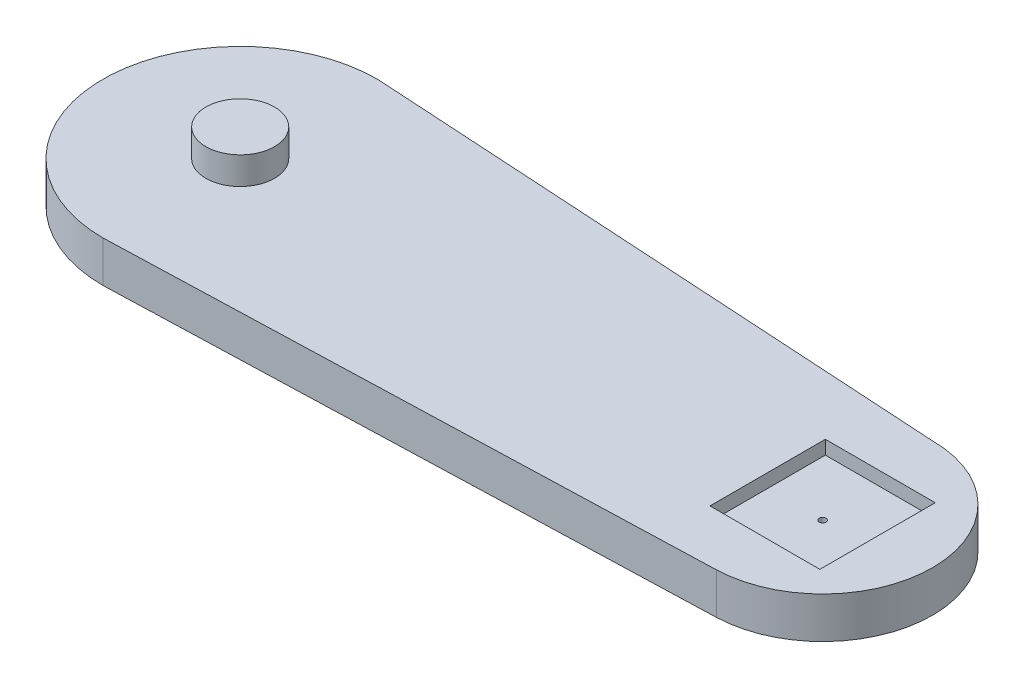
ISO-10303-21;
HEADER;
FILE_DESCRIPTION(('STEP AP214'),'2;1');
FILE_NAME('part.step','',(''),(''),'','','');
FILE_SCHEMA(('AUTOMOTIVE_DESIGN { 1 0 10303 214 1 1 1 1 }'));
ENDSEC;
DATA;
#1=APPLICATION_CONTEXT('core data for automotive mechanical design processes');
#2=APPLICATION_PROTOCOL_DEFINITION('international standard','automotive_design',2000,#1);
#3=PRODUCT_CONTEXT('',#1,'mechanical');
#4=PRODUCT('Part','Part','',(#3));
#5=PRODUCT_RELATED_PRODUCT_CATEGORY('part','',(#4));
#6=PRODUCT_DEFINITION_FORMATION('','',#4);
#7=PRODUCT_DEFINITION_CONTEXT('part definition',#1,'design');
#8=PRODUCT_DEFINITION('design','',#6,#7);
#9=PRODUCT_DEFINITION_SHAPE('','',#8);
#10=(LENGTH_UNIT() NAMED_UNIT(*) SI_UNIT(.MILLI.,.METRE.));
#11=(NAMED_UNIT(*) PLANE_ANGLE_UNIT() SI_UNIT($,.RADIAN.));
#12=(NAMED_UNIT(*) SI_UNIT($,.STERADIAN.) SOLID_ANGLE_UNIT());
#13=UNCERTAINTY_MEASURE_WITH_UNIT(LENGTH_MEASURE(1.E-05),#10,'distance_accuracy_value','');
#14=(GEOMETRIC_REPRESENTATION_CONTEXT(3) GLOBAL_UNCERTAINTY_ASSIGNED_CONTEXT((#13)) GLOBAL_UNIT_ASSIGNED_CONTEXT((#10,
#11,#12)) REPRESENTATION_CONTEXT('',''));
#15=CARTESIAN_POINT('',(0.,0.,0.));
#16=DIRECTION('',(0.,0.,1.));
#17=DIRECTION('',(1.,0.,0.));
#18=AXIS2_PLACEMENT_3D('',#15,#16,#17);
#19=CARTESIAN_POINT('',(0.,15.,0.));
#20=DIRECTION('',(0.,1.,0.));
#21=DIRECTION('',(0.,0.,1.));
#22=AXIS2_PLACEMENT_3D('',#19,#20,#21);
#23=PLANE('',#22);
#24=DIRECTION('',(0.,0.,-1.));
#25=VECTOR('',#24,1.);
#26=CARTESIAN_POINT('',(235.,15.,23.9977581529257));
#27=LINE('',#26,#25);
#28=CARTESIAN_POINT('',(235.,15.,23.9977581529257));
#29=VERTEX_POINT('',#28);
#30=CARTESIAN_POINT('',(235.,15.,-18.0022418470743));
#31=VERTEX_POINT('',#30);
#32=EDGE_CURVE('E61',#29,#31,#27,.T.);
#33=ORIENTED_EDGE('',*,*,#32,.F.);
#34=DIRECTION('',(1.,0.,0.));
#35=VECTOR('',#34,1.);
#36=CARTESIAN_POINT('',(195.,15.,23.9977581529257));
#37=LINE('',#36,#35);
#38=CARTESIAN_POINT('',(195.,15.,23.9977581529257));
#39=VERTEX_POINT('',#38);
#40=EDGE_CURVE('E143',#39,#29,#37,.T.);
#41=ORIENTED_EDGE('',*,*,#40,.F.);
#42=DIRECTION('',(0.,0.,1.));
#43=VECTOR('',#42,1.);
#44=CARTESIAN_POINT('',(195.,15.,23.9977581529257));
#45=LINE('',#44,#43);
#46=CARTESIAN_POINT('',(195.,15.,-18.0022418470743));
#47=VERTEX_POINT('',#46);
#48=EDGE_CURVE('E147',#47,#39,#45,.T.);
#49=ORIENTED_EDGE('',*,*,#48,.F.);
#50=DIRECTION('',(-1.,0.,0.));
#51=VECTOR('',#50,1.);
#52=CARTESIAN_POINT('',(195.,15.,-18.0022418470743));
#53=LINE('',#52,#51);
#54=EDGE_CURVE('E156',#31,#47,#53,.T.);
#55=ORIENTED_EDGE('',*,*,#54,.F.);
#56=EDGE_LOOP('',(#33,#41,#49,#55));
#57=FACE_BOUND('',#56,.T.);
#58=CARTESIAN_POINT('',(0.,15.,0.));
#59=DIRECTION('',(0.,1.,0.));
#60=DIRECTION('',(0.,0.,1.));
#61=AXIS2_PLACEMENT_3D('',#58,#59,#60);
#62=CIRCLE('',#61,12.5);
#63=CARTESIAN_POINT('',(0.,15.,12.5));
#64=VERTEX_POINT('',#63);
#65=EDGE_CURVE('E184',#64,#64,#62,.T.);
#66=ORIENTED_EDGE('',*,*,#65,.F.);
#67=EDGE_LOOP('',(#66));
#68=FACE_BOUND('',#67,.T.);
#69=CARTESIAN_POINT('',(0.,15.,0.));
#70=DIRECTION('',(0.,1.,0.));
#71=DIRECTION('',(0.,0.,1.));
#72=AXIS2_PLACEMENT_3D('',#69,#70,#71);
#73=CIRCLE('',#72,50.);
#74=CARTESIAN_POINT('',(0.,15.,-50.));
#75=VERTEX_POINT('',#74);
#76=CARTESIAN_POINT('',(0.,15.,50.));
#77=VERTEX_POINT('',#76);
#78=EDGE_CURVE('E196',#75,#77,#73,.T.);
#79=ORIENTED_EDGE('',*,*,#78,.T.);
#80=DIRECTION('',(0.999473249321184,0.,-0.0324534110896536));
#81=VECTOR('',#80,1.);
#82=CARTESIAN_POINT('',(0.,15.,50.));
#83=LINE('',#82,#81);
#84=CARTESIAN_POINT('',(216.298136443586,15.,42.976688125773));
#85=VERTEX_POINT('',#84);
#86=EDGE_CURVE('E98',#77,#85,#83,.T.);
#87=ORIENTED_EDGE('',*,*,#86,.T.);
#88=CARTESIAN_POINT('',(215.,15.,2.99775815292567));
#89=DIRECTION('',(0.,1.,0.));
#90=DIRECTION('',(0.,0.,1.));
#91=AXIS2_PLACEMENT_3D('',#88,#89,#90);
#92=CIRCLE('',#91,40.);
#93=CARTESIAN_POINT('',(215.,15.,-37.0022418470743));
#94=VERTEX_POINT('',#93);
#95=EDGE_CURVE('E201',#85,#94,#92,.T.);
#96=ORIENTED_EDGE('',*,*,#95,.T.);
#97=DIRECTION('',(-0.99817760907927,0.,-0.0603445170068741));
#98=VECTOR('',#97,1.);
#99=CARTESIAN_POINT('',(0.,15.,-50.));
#100=LINE('',#99,#98);
#101=EDGE_CURVE('E70',#94,#75,#100,.T.);
#102=ORIENTED_EDGE('',*,*,#101,.T.);
#103=EDGE_LOOP('',(#79,#87,#96,#102));
#104=FACE_BOUND('',#103,.T.);
#105=ADVANCED_FACE('F43',(#57,#68,#104),#23,.T.);
#106=CARTESIAN_POINT('',(0.,0.,0.));
#107=DIRECTION('',(0.,1.,0.));
#108=DIRECTION('',(0.,0.,1.));
#109=AXIS2_PLACEMENT_3D('',#106,#107,#108);
#110=PLANE('',#109);
#111=CARTESIAN_POINT('',(0.,0.,0.));
#112=DIRECTION('',(0.,-1.,0.));
#113=DIRECTION('',(0.,0.,-1.));
#114=AXIS2_PLACEMENT_3D('',#111,#112,#113);
#115=CIRCLE('',#114,11.);
#116=CARTESIAN_POINT('',(0.,0.,-11.));
#117=VERTEX_POINT('',#116);
#118=EDGE_CURVE('E175',#117,#117,#115,.T.);
#119=ORIENTED_EDGE('',*,*,#118,.F.);
#120=EDGE_LOOP('',(#119));
#121=FACE_BOUND('',#120,.T.);
#122=CARTESIAN_POINT('',(0.,0.,0.));
#123=DIRECTION('',(0.,1.,0.));
#124=DIRECTION('',(0.,0.,1.));
#125=AXIS2_PLACEMENT_3D('',#122,#123,#124);
#126=CIRCLE('',#125,50.);
#127=CARTESIAN_POINT('',(0.,0.,-50.));
#128=VERTEX_POINT('',#127);
#129=CARTESIAN_POINT('',(0.,0.,50.));
#130=VERTEX_POINT('',#129);
#131=EDGE_CURVE('E195',#128,#130,#126,.T.);
#132=ORIENTED_EDGE('',*,*,#131,.F.);
#133=DIRECTION('',(-0.99817760907927,0.,-0.0603445170068741));
#134=VECTOR('',#133,1.);
#135=CARTESIAN_POINT('',(0.,0.,-50.));
#136=LINE('',#135,#134);
#137=CARTESIAN_POINT('',(215.,0.,-37.0022418470743));
#138=VERTEX_POINT('',#137);
#139=EDGE_CURVE('E91',#138,#128,#136,.T.);
#140=ORIENTED_EDGE('',*,*,#139,.F.);
#141=CARTESIAN_POINT('',(215.,0.,2.99775815292567));
#142=DIRECTION('',(0.,1.,0.));
#143=DIRECTION('',(0.,0.,1.));
#144=AXIS2_PLACEMENT_3D('',#141,#142,#143);
#145=CIRCLE('',#144,40.);
#146=CARTESIAN_POINT('',(216.298136443586,0.,42.976688125773));
#147=VERTEX_POINT('',#146);
#148=EDGE_CURVE('E213',#147,#138,#145,.T.);
#149=ORIENTED_EDGE('',*,*,#148,.F.);
#150=DIRECTION('',(0.999473249321184,0.,-0.0324534110896536));
#151=VECTOR('',#150,1.);
#152=CARTESIAN_POINT('',(0.,0.,50.));
#153=LINE('',#152,#151);
#154=EDGE_CURVE('E210',#130,#147,#153,.T.);
#155=ORIENTED_EDGE('',*,*,#154,.F.);
#156=EDGE_LOOP('',(#132,#140,#149,#155));
#157=FACE_BOUND('',#156,.T.);
#158=CARTESIAN_POINT('',(215.,0.,2.99775815292567));
#159=DIRECTION('',(0.,1.,0.));
#160=DIRECTION('',(0.,0.,1.));
#161=AXIS2_PLACEMENT_3D('',#158,#159,#160);
#162=CIRCLE('',#161,1.24999999999974);
#163=CARTESIAN_POINT('',(215.,0.,4.2477581529254));
#164=VERTEX_POINT('',#163);
#165=EDGE_CURVE('E191',#164,#164,#162,.T.);
#166=ORIENTED_EDGE('',*,*,#165,.T.);
#167=EDGE_LOOP('',(#166));
#168=FACE_BOUND('',#167,.T.);
#169=ADVANCED_FACE('F245',(#121,#157,#168),#110,.F.);
#170=CARTESIAN_POINT('',(0.,15.,0.));
#171=DIRECTION('',(0.,-1.,0.));
#172=DIRECTION('',(0.,0.,-1.));
#173=AXIS2_PLACEMENT_3D('',#170,#171,#172);
#174=CYLINDRICAL_SURFACE('',#173,50.);
#175=ORIENTED_EDGE('',*,*,#131,.T.);
#176=DIRECTION('',(0.,-1.,0.));
#177=VECTOR('',#176,1.);
#178=CARTESIAN_POINT('',(0.,15.,50.));
#179=LINE('',#178,#177);
#180=EDGE_CURVE('E11',#77,#130,#179,.T.);
#181=ORIENTED_EDGE('',*,*,#180,.F.);
#182=ORIENTED_EDGE('',*,*,#78,.F.);
#183=DIRECTION('',(0.,-1.,0.));
#184=VECTOR('',#183,1.);
#185=CARTESIAN_POINT('',(0.,15.,-50.));
#186=LINE('',#185,#184);
#187=EDGE_CURVE('E206',#75,#128,#186,.T.);
#188=ORIENTED_EDGE('',*,*,#187,.T.);
#189=EDGE_LOOP('',(#175,#181,#182,#188));
#190=FACE_BOUND('',#189,.T.);
#191=ADVANCED_FACE('F45',(#190),#174,.T.);
#192=CARTESIAN_POINT('',(0.,15.,50.));
#193=DIRECTION('',(-0.0324534110896536,0.,-0.999473249321184));
#194=DIRECTION('',(-0.999473249321184,0.,0.0324534110896536));
#195=AXIS2_PLACEMENT_3D('',#192,#193,#194);
#196=PLANE('',#195);
#197=ORIENTED_EDGE('',*,*,#154,.T.);
#198=DIRECTION('',(0.,-1.,0.));
#199=VECTOR('',#198,1.);
#200=CARTESIAN_POINT('',(216.298136443586,15.,42.976688125773));
#201=LINE('',#200,#199);
#202=EDGE_CURVE('E53',#85,#147,#201,.T.);
#203=ORIENTED_EDGE('',*,*,#202,.F.);
#204=ORIENTED_EDGE('',*,*,#86,.F.);
#205=ORIENTED_EDGE('',*,*,#180,.T.);
#206=EDGE_LOOP('',(#197,#203,#204,#205));
#207=FACE_BOUND('',#206,.T.);
#208=ADVANCED_FACE('F277',(#207),#196,.F.);
#209=CARTESIAN_POINT('',(215.,15.,2.99775815292567));
#210=DIRECTION('',(0.,-1.,0.));
#211=DIRECTION('',(0.,0.,-1.));
#212=AXIS2_PLACEMENT_3D('',#209,#210,#211);
#213=CYLINDRICAL_SURFACE('',#212,40.);
#214=ORIENTED_EDGE('',*,*,#148,.T.);
#215=DIRECTION('',(0.,-1.,0.));
#216=VECTOR('',#215,1.);
#217=CARTESIAN_POINT('',(215.,15.,-37.0022418470743));
#218=LINE('',#217,#216);
#219=EDGE_CURVE('E220',#94,#138,#218,.T.);
#220=ORIENTED_EDGE('',*,*,#219,.F.);
#221=ORIENTED_EDGE('',*,*,#95,.F.);
#222=ORIENTED_EDGE('',*,*,#202,.T.);
#223=EDGE_LOOP('',(#214,#220,#221,#222));
#224=FACE_BOUND('',#223,.T.);
#225=ADVANCED_FACE('F265',(#224),#213,.T.);
#226=CARTESIAN_POINT('',(0.,15.,-50.));
#227=DIRECTION('',(-0.0603445170068741,0.,0.998177609079269));
#228=DIRECTION('',(0.99817760907927,0.,0.0603445170068741));
#229=AXIS2_PLACEMENT_3D('',#226,#227,#228);
#230=PLANE('',#229);
#231=ORIENTED_EDGE('',*,*,#139,.T.);
#232=ORIENTED_EDGE('',*,*,#187,.F.);
#233=ORIENTED_EDGE('',*,*,#101,.F.);
#234=ORIENTED_EDGE('',*,*,#219,.T.);
#235=EDGE_LOOP('',(#231,#232,#233,#234));
#236=FACE_BOUND('',#235,.T.);
#237=ADVANCED_FACE('F256',(#236),#230,.F.);
#238=CARTESIAN_POINT('',(215.,15.,2.99775815292567));
#239=DIRECTION('',(0.,-1.,0.));
#240=DIRECTION('',(0.,0.,-1.));
#241=AXIS2_PLACEMENT_3D('',#238,#239,#240);
#242=CYLINDRICAL_SURFACE('',#241,1.24999999999974);
#243=CARTESIAN_POINT('',(215.,10.,2.99775815292567));
#244=DIRECTION('',(0.,-1.,0.));
#245=DIRECTION('',(0.,0.,-1.));
#246=AXIS2_PLACEMENT_3D('',#243,#244,#245);
#247=CIRCLE('',#246,1.24999999999974);
#248=CARTESIAN_POINT('',(215.,10.,1.74775815292593));
#249=VERTEX_POINT('',#248);
#250=EDGE_CURVE('E47',#249,#249,#247,.T.);
#251=ORIENTED_EDGE('',*,*,#250,.F.);
#252=EDGE_LOOP('',(#251));
#253=FACE_BOUND('',#252,.T.);
#254=ORIENTED_EDGE('',*,*,#165,.F.);
#255=EDGE_LOOP('',(#254));
#256=FACE_BOUND('',#255,.T.);
#257=ADVANCED_FACE('F253',(#253,#256),#242,.F.);
#258=CARTESIAN_POINT('',(0.,25.,0.));
#259=DIRECTION('',(0.,-1.,0.));
#260=DIRECTION('',(0.,0.,-1.));
#261=AXIS2_PLACEMENT_3D('',#258,#259,#260);
#262=CYLINDRICAL_SURFACE('',#261,12.5);
#263=CARTESIAN_POINT('',(0.,25.,0.));
#264=DIRECTION('',(0.,1.,0.));
#265=DIRECTION('',(0.,0.,1.));
#266=AXIS2_PLACEMENT_3D('',#263,#264,#265);
#267=CIRCLE('',#266,12.5);
#268=CARTESIAN_POINT('',(0.,25.,12.5));
#269=VERTEX_POINT('',#268);
#270=EDGE_CURVE('E179',#269,#269,#267,.T.);
#271=ORIENTED_EDGE('',*,*,#270,.F.);
#272=EDGE_LOOP('',(#271));
#273=FACE_BOUND('',#272,.T.);
#274=ORIENTED_EDGE('',*,*,#65,.T.);
#275=EDGE_LOOP('',(#274));
#276=FACE_BOUND('',#275,.T.);
#277=ADVANCED_FACE('F255',(#273,#276),#262,.T.);
#278=CARTESIAN_POINT('',(0.,25.,0.));
#279=DIRECTION('',(0.,1.,0.));
#280=DIRECTION('',(0.,0.,1.));
#281=AXIS2_PLACEMENT_3D('',#278,#279,#280);
#282=PLANE('',#281);
#283=ORIENTED_EDGE('',*,*,#270,.T.);
#284=EDGE_LOOP('',(#283));
#285=FACE_BOUND('',#284,.T.);
#286=ADVANCED_FACE('F241',(#285),#282,.T.);
#287=CARTESIAN_POINT('',(0.,5.,0.));
#288=DIRECTION('',(0.,-1.,0.));
#289=DIRECTION('',(0.,0.,-1.));
#290=AXIS2_PLACEMENT_3D('',#287,#288,#289);
#291=CYLINDRICAL_SURFACE('',#290,11.);
#292=CARTESIAN_POINT('',(0.,5.,0.));
#293=DIRECTION('',(0.,-1.,0.));
#294=DIRECTION('',(0.,0.,-1.));
#295=AXIS2_PLACEMENT_3D('',#292,#293,#294);
#296=CIRCLE('',#295,11.);
#297=CARTESIAN_POINT('',(0.,5.,-11.));
#298=VERTEX_POINT('',#297);
#299=EDGE_CURVE('E170',#298,#298,#296,.T.);
#300=ORIENTED_EDGE('',*,*,#299,.F.);
#301=EDGE_LOOP('',(#300));
#302=FACE_BOUND('',#301,.T.);
#303=ORIENTED_EDGE('',*,*,#118,.T.);
#304=EDGE_LOOP('',(#303));
#305=FACE_BOUND('',#304,.T.);
#306=ADVANCED_FACE('F235',(#302,#305),#291,.F.);
#307=CARTESIAN_POINT('',(0.,5.,0.));
#308=DIRECTION('',(0.,-1.,0.));
#309=DIRECTION('',(0.,0.,-1.));
#310=AXIS2_PLACEMENT_3D('',#307,#308,#309);
#311=PLANE('',#310);
#312=CARTESIAN_POINT('',(0.,5.,0.));
#313=DIRECTION('',(0.,-1.,0.));
#314=DIRECTION('',(0.,0.,-1.));
#315=AXIS2_PLACEMENT_3D('',#312,#313,#314);
#316=CIRCLE('',#315,1.25);
#317=CARTESIAN_POINT('',(0.,5.,-1.25));
#318=VERTEX_POINT('',#317);
#319=EDGE_CURVE('E174',#318,#318,#316,.T.);
#320=ORIENTED_EDGE('',*,*,#319,.F.);
#321=EDGE_LOOP('',(#320));
#322=FACE_BOUND('',#321,.T.);
#323=ORIENTED_EDGE('',*,*,#299,.T.);
#324=EDGE_LOOP('',(#323));
#325=FACE_BOUND('',#324,.T.);
#326=ADVANCED_FACE('F231',(#322,#325),#311,.T.);
#327=CARTESIAN_POINT('',(0.,15.,0.));
#328=DIRECTION('',(0.,1.,0.));
#329=DIRECTION('',(0.,0.,1.));
#330=AXIS2_PLACEMENT_3D('',#327,#328,#329);
#331=PLANE('',#330);
#332=CARTESIAN_POINT('',(0.,15.,0.));
#333=DIRECTION('',(0.,1.,0.));
#334=DIRECTION('',(0.,0.,1.));
#335=AXIS2_PLACEMENT_3D('',#332,#333,#334);
#336=CIRCLE('',#335,1.25);
#337=CARTESIAN_POINT('',(0.,15.,1.25));
#338=VERTEX_POINT('',#337);
#339=EDGE_CURVE('E183',#338,#338,#336,.T.);
#340=ORIENTED_EDGE('',*,*,#339,.F.);
#341=EDGE_LOOP('',(#340));
#342=FACE_BOUND('',#341,.T.);
#343=ADVANCED_FACE('F234',(#342),#331,.F.);
#344=CARTESIAN_POINT('',(0.,15.,0.));
#345=DIRECTION('',(0.,-1.,0.));
#346=DIRECTION('',(0.,0.,-1.));
#347=AXIS2_PLACEMENT_3D('',#344,#345,#346);
#348=CYLINDRICAL_SURFACE('',#347,1.25);
#349=ORIENTED_EDGE('',*,*,#339,.T.);
#350=EDGE_LOOP('',(#349));
#351=FACE_BOUND('',#350,.T.);
#352=ORIENTED_EDGE('',*,*,#319,.T.);
#353=EDGE_LOOP('',(#352));
#354=FACE_BOUND('',#353,.T.);
#355=ADVANCED_FACE('F229',(#351,#354),#348,.F.);
#356=CARTESIAN_POINT('',(235.,10.,23.9977581529257));
#357=DIRECTION('',(1.,0.,0.));
#358=DIRECTION('',(0.,0.,-1.));
#359=AXIS2_PLACEMENT_3D('',#356,#357,#358);
#360=PLANE('',#359);
#361=ORIENTED_EDGE('',*,*,#32,.T.);
#362=DIRECTION('',(0.,1.,0.));
#363=VECTOR('',#362,1.);
#364=CARTESIAN_POINT('',(235.,10.,-18.0022418470743));
#365=LINE('',#364,#363);
#366=CARTESIAN_POINT('',(235.,10.,-18.0022418470743));
#367=VERTEX_POINT('',#366);
#368=EDGE_CURVE('E118',#367,#31,#365,.T.);
#369=ORIENTED_EDGE('',*,*,#368,.F.);
#370=DIRECTION('',(0.,0.,-1.));
#371=VECTOR('',#370,1.);
#372=CARTESIAN_POINT('',(235.,10.,23.9977581529257));
#373=LINE('',#372,#371);
#374=CARTESIAN_POINT('',(235.,10.,23.9977581529257));
#375=VERTEX_POINT('',#374);
#376=EDGE_CURVE('E122',#375,#367,#373,.T.);
#377=ORIENTED_EDGE('',*,*,#376,.F.);
#378=DIRECTION('',(0.,1.,0.));
#379=VECTOR('',#378,1.);
#380=CARTESIAN_POINT('',(235.,10.,23.9977581529257));
#381=LINE('',#380,#379);
#382=EDGE_CURVE('E162',#375,#29,#381,.T.);
#383=ORIENTED_EDGE('',*,*,#382,.T.);
#384=EDGE_LOOP('',(#361,#369,#377,#383));
#385=FACE_BOUND('',#384,.T.);
#386=ADVANCED_FACE('F120',(#385),#360,.F.);
#387=CARTESIAN_POINT('',(195.,10.,23.9977581529257));
#388=DIRECTION('',(0.,0.,1.));
#389=DIRECTION('',(1.,0.,0.));
#390=AXIS2_PLACEMENT_3D('',#387,#388,#389);
#391=PLANE('',#390);
#392=ORIENTED_EDGE('',*,*,#40,.T.);
#393=ORIENTED_EDGE('',*,*,#382,.F.);
#394=DIRECTION('',(1.,0.,0.));
#395=VECTOR('',#394,1.);
#396=CARTESIAN_POINT('',(195.,10.,23.9977581529257));
#397=LINE('',#396,#395);
#398=CARTESIAN_POINT('',(195.,10.,23.9977581529257));
#399=VERTEX_POINT('',#398);
#400=EDGE_CURVE('E129',#399,#375,#397,.T.);
#401=ORIENTED_EDGE('',*,*,#400,.F.);
#402=DIRECTION('',(0.,1.,0.));
#403=VECTOR('',#402,1.);
#404=CARTESIAN_POINT('',(195.,10.,23.9977581529257));
#405=LINE('',#404,#403);
#406=EDGE_CURVE('E165',#399,#39,#405,.T.);
#407=ORIENTED_EDGE('',*,*,#406,.T.);
#408=EDGE_LOOP('',(#392,#393,#401,#407));
#409=FACE_BOUND('',#408,.T.);
#410=ADVANCED_FACE('F346',(#409),#391,.F.);
#411=CARTESIAN_POINT('',(195.,10.,23.9977581529257));
#412=DIRECTION('',(-1.,0.,0.));
#413=DIRECTION('',(0.,0.,1.));
#414=AXIS2_PLACEMENT_3D('',#411,#412,#413);
#415=PLANE('',#414);
#416=ORIENTED_EDGE('',*,*,#48,.T.);
#417=ORIENTED_EDGE('',*,*,#406,.F.);
#418=DIRECTION('',(0.,0.,1.));
#419=VECTOR('',#418,1.);
#420=CARTESIAN_POINT('',(195.,10.,23.9977581529257));
#421=LINE('',#420,#419);
#422=CARTESIAN_POINT('',(195.,10.,-18.0022418470743));
#423=VERTEX_POINT('',#422);
#424=EDGE_CURVE('E138',#423,#399,#421,.T.);
#425=ORIENTED_EDGE('',*,*,#424,.F.);
#426=DIRECTION('',(0.,1.,0.));
#427=VECTOR('',#426,1.);
#428=CARTESIAN_POINT('',(195.,10.,-18.0022418470743));
#429=LINE('',#428,#427);
#430=EDGE_CURVE('E128',#423,#47,#429,.T.);
#431=ORIENTED_EDGE('',*,*,#430,.T.);
#432=EDGE_LOOP('',(#416,#417,#425,#431));
#433=FACE_BOUND('',#432,.T.);
#434=ADVANCED_FACE('F356',(#433),#415,.F.);
#435=CARTESIAN_POINT('',(195.,10.,-18.0022418470743));
#436=DIRECTION('',(0.,0.,-1.));
#437=DIRECTION('',(-1.,0.,0.));
#438=AXIS2_PLACEMENT_3D('',#435,#436,#437);
#439=PLANE('',#438);
#440=ORIENTED_EDGE('',*,*,#54,.T.);
#441=ORIENTED_EDGE('',*,*,#430,.F.);
#442=DIRECTION('',(-1.,0.,0.));
#443=VECTOR('',#442,1.);
#444=CARTESIAN_POINT('',(195.,10.,-18.0022418470743));
#445=LINE('',#444,#443);
#446=EDGE_CURVE('E132',#367,#423,#445,.T.);
#447=ORIENTED_EDGE('',*,*,#446,.F.);
#448=ORIENTED_EDGE('',*,*,#368,.T.);
#449=EDGE_LOOP('',(#440,#441,#447,#448));
#450=FACE_BOUND('',#449,.T.);
#451=ADVANCED_FACE('F133',(#450),#439,.F.);
#452=CARTESIAN_POINT('',(0.,10.,0.));
#453=DIRECTION('',(0.,-1.,0.));
#454=DIRECTION('',(0.,0.,-1.));
#455=AXIS2_PLACEMENT_3D('',#452,#453,#454);
#456=PLANE('',#455);
#457=ORIENTED_EDGE('',*,*,#250,.T.);
#458=EDGE_LOOP('',(#457));
#459=FACE_BOUND('',#458,.T.);
#460=ORIENTED_EDGE('',*,*,#376,.T.);
#461=ORIENTED_EDGE('',*,*,#446,.T.);
#462=ORIENTED_EDGE('',*,*,#424,.T.);
#463=ORIENTED_EDGE('',*,*,#400,.T.);
#464=EDGE_LOOP('',(#460,#461,#462,#463));
#465=FACE_BOUND('',#464,.T.);
#466=ADVANCED_FACE('F140',(#459,#465),#456,.F.);
#467=CLOSED_SHELL('',(#105,#169,#191,#208,#225,#237,#257,#277,#286,#306,#326,#343,#355,#386,
#410,#434,#451,#466));
#468=MANIFOLD_SOLID_BREP('B2',#467);
#469=ADVANCED_BREP_SHAPE_REPRESENTATION('',(#18,#468),#14);
#470=SHAPE_DEFINITION_REPRESENTATION(#9,#469);
ENDSEC;
END-ISO-10303-21;
